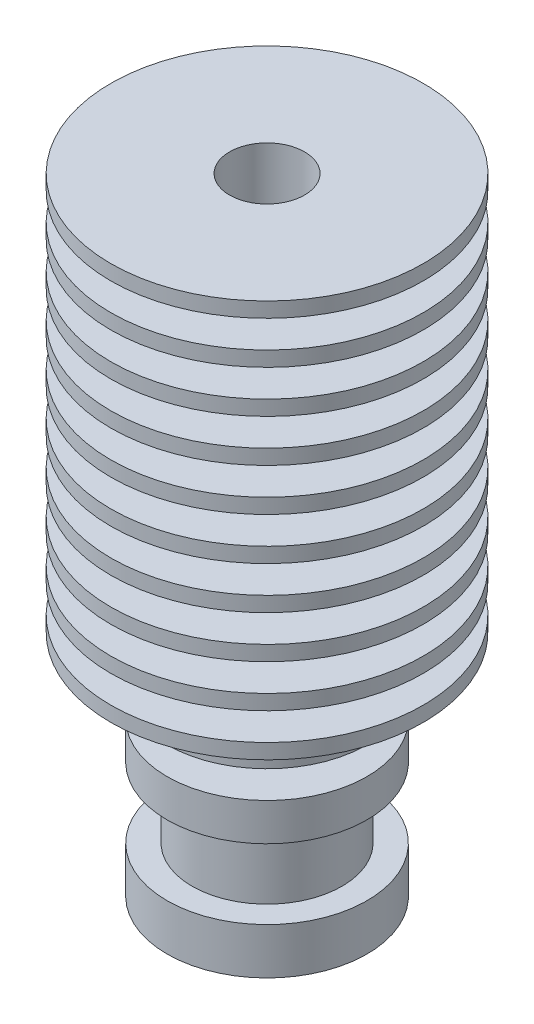
ISO-10303-21;
HEADER;
FILE_DESCRIPTION(('STEP AP214'),'2;1');
FILE_NAME('part.step','',(''),(''),'','','');
FILE_SCHEMA(('AUTOMOTIVE_DESIGN { 1 0 10303 214 1 1 1 1 }'));
ENDSEC;
DATA;
#1=APPLICATION_CONTEXT('core data for automotive mechanical design processes');
#2=APPLICATION_PROTOCOL_DEFINITION('international standard','automotive_design',2000,#1);
#3=PRODUCT_CONTEXT('',#1,'mechanical');
#4=PRODUCT('Part','Part','',(#3));
#5=PRODUCT_RELATED_PRODUCT_CATEGORY('part','',(#4));
#6=PRODUCT_DEFINITION_FORMATION('','',#4);
#7=PRODUCT_DEFINITION_CONTEXT('part definition',#1,'design');
#8=PRODUCT_DEFINITION('design','',#6,#7);
#9=PRODUCT_DEFINITION_SHAPE('','',#8);
#10=(LENGTH_UNIT() NAMED_UNIT(*) SI_UNIT(.MILLI.,.METRE.));
#11=(NAMED_UNIT(*) PLANE_ANGLE_UNIT() SI_UNIT($,.RADIAN.));
#12=(NAMED_UNIT(*) SI_UNIT($,.STERADIAN.) SOLID_ANGLE_UNIT());
#13=UNCERTAINTY_MEASURE_WITH_UNIT(LENGTH_MEASURE(1.E-05),#10,'distance_accuracy_value','');
#14=(GEOMETRIC_REPRESENTATION_CONTEXT(3) GLOBAL_UNCERTAINTY_ASSIGNED_CONTEXT((#13)) GLOBAL_UNIT_ASSIGNED_CONTEXT((#10,
#11,#12)) REPRESENTATION_CONTEXT('',''));
#15=CARTESIAN_POINT('',(0.,0.,0.));
#16=DIRECTION('',(0.,0.,1.));
#17=DIRECTION('',(1.,0.,0.));
#18=AXIS2_PLACEMENT_3D('',#15,#16,#17);
#19=CARTESIAN_POINT('',(0.,50.0999999999996,0.));
#20=DIRECTION('',(0.,-1.,0.));
#21=DIRECTION('',(0.,0.,-1.));
#22=AXIS2_PLACEMENT_3D('',#19,#20,#21);
#23=PLANE('',#22);
#24=CARTESIAN_POINT('',(0.,50.0999999999997,0.));
#25=DIRECTION('',(0.,1.,0.));
#26=DIRECTION('',(0.,0.,1.));
#27=AXIS2_PLACEMENT_3D('',#24,#25,#26);
#28=CIRCLE('',#27,12.5);
#29=CARTESIAN_POINT('',(0.,50.0999999999997,12.5));
#30=VERTEX_POINT('',#29);
#31=EDGE_CURVE('E190',#30,#30,#28,.T.);
#32=ORIENTED_EDGE('',*,*,#31,.T.);
#33=EDGE_LOOP('',(#32));
#34=FACE_BOUND('',#33,.T.);
#35=CARTESIAN_POINT('',(0.,50.0999999999996,0.));
#36=DIRECTION('',(0.,1.,0.));
#37=DIRECTION('',(0.,0.,1.));
#38=AXIS2_PLACEMENT_3D('',#35,#36,#37);
#39=CIRCLE('',#38,3.);
#40=CARTESIAN_POINT('',(0.,50.0999999999996,3.));
#41=VERTEX_POINT('',#40);
#42=EDGE_CURVE('E217',#41,#41,#39,.T.);
#43=ORIENTED_EDGE('',*,*,#42,.F.);
#44=EDGE_LOOP('',(#43));
#45=FACE_BOUND('',#44,.T.);
#46=ADVANCED_FACE('F36',(#34,#45),#23,.F.);
#47=CARTESIAN_POINT('',(0.,0.,0.));
#48=DIRECTION('',(0.,1.,0.));
#49=DIRECTION('',(0.,0.,1.));
#50=AXIS2_PLACEMENT_3D('',#47,#48,#49);
#51=PLANE('',#50);
#52=CARTESIAN_POINT('',(0.,0.,0.));
#53=DIRECTION('',(0.,1.,0.));
#54=DIRECTION('',(0.,0.,1.));
#55=AXIS2_PLACEMENT_3D('',#52,#53,#54);
#56=CIRCLE('',#55,8.);
#57=CARTESIAN_POINT('',(0.,0.,8.));
#58=VERTEX_POINT('',#57);
#59=EDGE_CURVE('E10',#58,#58,#56,.T.);
#60=ORIENTED_EDGE('',*,*,#59,.F.);
#61=EDGE_LOOP('',(#60));
#62=FACE_BOUND('',#61,.T.);
#63=CARTESIAN_POINT('',(0.,0.,0.));
#64=DIRECTION('',(0.,1.,0.));
#65=DIRECTION('',(0.,0.,1.));
#66=AXIS2_PLACEMENT_3D('',#63,#64,#65);
#67=CIRCLE('',#66,3.2);
#68=CARTESIAN_POINT('',(0.,0.,3.2));
#69=VERTEX_POINT('',#68);
#70=EDGE_CURVE('E193',#69,#69,#67,.T.);
#71=ORIENTED_EDGE('',*,*,#70,.T.);
#72=EDGE_LOOP('',(#71));
#73=FACE_BOUND('',#72,.T.);
#74=ADVANCED_FACE('F225',(#62,#73),#51,.F.);
#75=CARTESIAN_POINT('',(0.,50.0999999999996,0.));
#76=DIRECTION('',(0.,1.,0.));
#77=DIRECTION('',(0.,0.,1.));
#78=AXIS2_PLACEMENT_3D('',#75,#76,#77);
#79=CYLINDRICAL_SURFACE('',#78,8.);
#80=CARTESIAN_POINT('',(0.,3.7,0.));
#81=DIRECTION('',(0.,1.,0.));
#82=DIRECTION('',(0.,0.,1.));
#83=AXIS2_PLACEMENT_3D('',#80,#81,#82);
#84=CIRCLE('',#83,8.);
#85=CARTESIAN_POINT('',(0.,3.7,8.));
#86=VERTEX_POINT('',#85);
#87=EDGE_CURVE('E42',#86,#86,#84,.T.);
#88=ORIENTED_EDGE('',*,*,#87,.F.);
#89=EDGE_LOOP('',(#88));
#90=FACE_BOUND('',#89,.T.);
#91=ORIENTED_EDGE('',*,*,#59,.T.);
#92=EDGE_LOOP('',(#91));
#93=FACE_BOUND('',#92,.T.);
#94=ADVANCED_FACE('F230',(#90,#93),#79,.T.);
#95=CARTESIAN_POINT('',(0.,3.7,0.));
#96=DIRECTION('',(0.,-1.,0.));
#97=DIRECTION('',(0.,0.,-1.));
#98=AXIS2_PLACEMENT_3D('',#95,#96,#97);
#99=PLANE('',#98);
#100=CARTESIAN_POINT('',(0.,3.7,0.));
#101=DIRECTION('',(0.,1.,0.));
#102=DIRECTION('',(0.,0.,1.));
#103=AXIS2_PLACEMENT_3D('',#100,#101,#102);
#104=CIRCLE('',#103,6.);
#105=CARTESIAN_POINT('',(0.,3.7,6.));
#106=VERTEX_POINT('',#105);
#107=EDGE_CURVE('E46',#106,#106,#104,.T.);
#108=ORIENTED_EDGE('',*,*,#107,.F.);
#109=EDGE_LOOP('',(#108));
#110=FACE_BOUND('',#109,.T.);
#111=ORIENTED_EDGE('',*,*,#87,.T.);
#112=EDGE_LOOP('',(#111));
#113=FACE_BOUND('',#112,.T.);
#114=ADVANCED_FACE('F514',(#110,#113),#99,.F.);
#115=CARTESIAN_POINT('',(0.,50.0999999999996,0.));
#116=DIRECTION('',(0.,1.,0.));
#117=DIRECTION('',(0.,0.,1.));
#118=AXIS2_PLACEMENT_3D('',#115,#116,#117);
#119=CYLINDRICAL_SURFACE('',#118,6.);
#120=CARTESIAN_POINT('',(0.,9.3,0.));
#121=DIRECTION('',(0.,1.,0.));
#122=DIRECTION('',(0.,0.,1.));
#123=AXIS2_PLACEMENT_3D('',#120,#121,#122);
#124=CIRCLE('',#123,6.);
#125=CARTESIAN_POINT('',(0.,9.3,6.));
#126=VERTEX_POINT('',#125);
#127=EDGE_CURVE('E50',#126,#126,#124,.T.);
#128=ORIENTED_EDGE('',*,*,#127,.F.);
#129=EDGE_LOOP('',(#128));
#130=FACE_BOUND('',#129,.T.);
#131=ORIENTED_EDGE('',*,*,#107,.T.);
#132=EDGE_LOOP('',(#131));
#133=FACE_BOUND('',#132,.T.);
#134=ADVANCED_FACE('F508',(#130,#133),#119,.T.);
#135=CARTESIAN_POINT('',(0.,9.3,0.));
#136=DIRECTION('',(0.,1.,0.));
#137=DIRECTION('',(0.,0.,1.));
#138=AXIS2_PLACEMENT_3D('',#135,#136,#137);
#139=PLANE('',#138);
#140=CARTESIAN_POINT('',(0.,9.3,0.));
#141=DIRECTION('',(0.,1.,0.));
#142=DIRECTION('',(0.,0.,1.));
#143=AXIS2_PLACEMENT_3D('',#140,#141,#142);
#144=CIRCLE('',#143,8.);
#145=CARTESIAN_POINT('',(0.,9.3,8.));
#146=VERTEX_POINT('',#145);
#147=EDGE_CURVE('E55',#146,#146,#144,.T.);
#148=ORIENTED_EDGE('',*,*,#147,.F.);
#149=EDGE_LOOP('',(#148));
#150=FACE_BOUND('',#149,.T.);
#151=ORIENTED_EDGE('',*,*,#127,.T.);
#152=EDGE_LOOP('',(#151));
#153=FACE_BOUND('',#152,.T.);
#154=ADVANCED_FACE('F502',(#150,#153),#139,.F.);
#155=CARTESIAN_POINT('',(0.,50.0999999999996,0.));
#156=DIRECTION('',(0.,1.,0.));
#157=DIRECTION('',(0.,0.,1.));
#158=AXIS2_PLACEMENT_3D('',#155,#156,#157);
#159=CYLINDRICAL_SURFACE('',#158,8.);
#160=CARTESIAN_POINT('',(0.,12.3,0.));
#161=DIRECTION('',(0.,1.,0.));
#162=DIRECTION('',(0.,0.,1.));
#163=AXIS2_PLACEMENT_3D('',#160,#161,#162);
#164=CIRCLE('',#163,8.);
#165=CARTESIAN_POINT('',(0.,12.3,8.));
#166=VERTEX_POINT('',#165);
#167=EDGE_CURVE('E58',#166,#166,#164,.T.);
#168=ORIENTED_EDGE('',*,*,#167,.F.);
#169=EDGE_LOOP('',(#168));
#170=FACE_BOUND('',#169,.T.);
#171=ORIENTED_EDGE('',*,*,#147,.T.);
#172=EDGE_LOOP('',(#171));
#173=FACE_BOUND('',#172,.T.);
#174=ADVANCED_FACE('F496',(#170,#173),#159,.T.);
#175=CARTESIAN_POINT('',(0.,12.3,0.));
#176=DIRECTION('',(0.,-1.,0.));
#177=DIRECTION('',(0.,0.,-1.));
#178=AXIS2_PLACEMENT_3D('',#175,#176,#177);
#179=PLANE('',#178);
#180=CARTESIAN_POINT('',(0.,12.3,0.));
#181=DIRECTION('',(0.,1.,0.));
#182=DIRECTION('',(0.,0.,1.));
#183=AXIS2_PLACEMENT_3D('',#180,#181,#182);
#184=CIRCLE('',#183,4.5);
#185=CARTESIAN_POINT('',(0.,12.3,4.5));
#186=VERTEX_POINT('',#185);
#187=EDGE_CURVE('E61',#186,#186,#184,.T.);
#188=ORIENTED_EDGE('',*,*,#187,.F.);
#189=EDGE_LOOP('',(#188));
#190=FACE_BOUND('',#189,.T.);
#191=ORIENTED_EDGE('',*,*,#167,.T.);
#192=EDGE_LOOP('',(#191));
#193=FACE_BOUND('',#192,.T.);
#194=ADVANCED_FACE('F490',(#190,#193),#179,.F.);
#195=CARTESIAN_POINT('',(0.,50.0999999999996,0.));
#196=DIRECTION('',(0.,1.,0.));
#197=DIRECTION('',(0.,0.,1.));
#198=AXIS2_PLACEMENT_3D('',#195,#196,#197);
#199=CYLINDRICAL_SURFACE('',#198,4.5);
#200=CARTESIAN_POINT('',(0.,14.5,0.));
#201=DIRECTION('',(0.,1.,0.));
#202=DIRECTION('',(0.,0.,1.));
#203=AXIS2_PLACEMENT_3D('',#200,#201,#202);
#204=CIRCLE('',#203,4.5);
#205=CARTESIAN_POINT('',(0.,14.5,4.5));
#206=VERTEX_POINT('',#205);
#207=EDGE_CURVE('E64',#206,#206,#204,.T.);
#208=ORIENTED_EDGE('',*,*,#207,.F.);
#209=EDGE_LOOP('',(#208));
#210=FACE_BOUND('',#209,.T.);
#211=ORIENTED_EDGE('',*,*,#187,.T.);
#212=EDGE_LOOP('',(#211));
#213=FACE_BOUND('',#212,.T.);
#214=ADVANCED_FACE('F484',(#210,#213),#199,.T.);
#215=CARTESIAN_POINT('',(0.,14.5,0.));
#216=DIRECTION('',(0.,1.,0.));
#217=DIRECTION('',(0.,0.,1.));
#218=AXIS2_PLACEMENT_3D('',#215,#216,#217);
#219=PLANE('',#218);
#220=CARTESIAN_POINT('',(0.,14.5,0.));
#221=DIRECTION('',(0.,1.,0.));
#222=DIRECTION('',(0.,0.,1.));
#223=AXIS2_PLACEMENT_3D('',#220,#221,#222);
#224=CIRCLE('',#223,8.);
#225=CARTESIAN_POINT('',(0.,14.5,8.));
#226=VERTEX_POINT('',#225);
#227=EDGE_CURVE('E67',#226,#226,#224,.T.);
#228=ORIENTED_EDGE('',*,*,#227,.F.);
#229=EDGE_LOOP('',(#228));
#230=FACE_BOUND('',#229,.T.);
#231=ORIENTED_EDGE('',*,*,#207,.T.);
#232=EDGE_LOOP('',(#231));
#233=FACE_BOUND('',#232,.T.);
#234=ADVANCED_FACE('F478',(#230,#233),#219,.F.);
#235=CARTESIAN_POINT('',(0.,50.0999999999996,0.));
#236=DIRECTION('',(0.,1.,0.));
#237=DIRECTION('',(0.,0.,1.));
#238=AXIS2_PLACEMENT_3D('',#235,#236,#237);
#239=CYLINDRICAL_SURFACE('',#238,8.);
#240=CARTESIAN_POINT('',(0.,16.1,0.));
#241=DIRECTION('',(0.,1.,0.));
#242=DIRECTION('',(0.,0.,1.));
#243=AXIS2_PLACEMENT_3D('',#240,#241,#242);
#244=CIRCLE('',#243,8.);
#245=CARTESIAN_POINT('',(0.,16.1,8.));
#246=VERTEX_POINT('',#245);
#247=EDGE_CURVE('E70',#246,#246,#244,.T.);
#248=ORIENTED_EDGE('',*,*,#247,.F.);
#249=EDGE_LOOP('',(#248));
#250=FACE_BOUND('',#249,.T.);
#251=ORIENTED_EDGE('',*,*,#227,.T.);
#252=EDGE_LOOP('',(#251));
#253=FACE_BOUND('',#252,.T.);
#254=ADVANCED_FACE('F472',(#250,#253),#239,.T.);
#255=CARTESIAN_POINT('',(0.,16.1,0.));
#256=DIRECTION('',(0.,-1.,0.));
#257=DIRECTION('',(0.,0.,-1.));
#258=AXIS2_PLACEMENT_3D('',#255,#256,#257);
#259=PLANE('',#258);
#260=CARTESIAN_POINT('',(0.,16.1,0.));
#261=DIRECTION('',(0.,1.,0.));
#262=DIRECTION('',(0.,0.,1.));
#263=AXIS2_PLACEMENT_3D('',#260,#261,#262);
#264=CIRCLE('',#263,4.49999999999996);
#265=CARTESIAN_POINT('',(0.,16.1,4.49999999999996));
#266=VERTEX_POINT('',#265);
#267=EDGE_CURVE('E73',#266,#266,#264,.T.);
#268=ORIENTED_EDGE('',*,*,#267,.F.);
#269=EDGE_LOOP('',(#268));
#270=FACE_BOUND('',#269,.T.);
#271=ORIENTED_EDGE('',*,*,#247,.T.);
#272=EDGE_LOOP('',(#271));
#273=FACE_BOUND('',#272,.T.);
#274=ADVANCED_FACE('F466',(#270,#273),#259,.F.);
#275=CARTESIAN_POINT('',(0.,50.0999999999996,0.));
#276=DIRECTION('',(0.,1.,0.));
#277=DIRECTION('',(0.,0.,1.));
#278=AXIS2_PLACEMENT_3D('',#275,#276,#277);
#279=CYLINDRICAL_SURFACE('',#278,4.49999999999996);
#280=CARTESIAN_POINT('',(0.,18.3,0.));
#281=DIRECTION('',(0.,1.,0.));
#282=DIRECTION('',(0.,0.,1.));
#283=AXIS2_PLACEMENT_3D('',#280,#281,#282);
#284=CIRCLE('',#283,4.49999999999996);
#285=CARTESIAN_POINT('',(0.,18.3,4.49999999999996));
#286=VERTEX_POINT('',#285);
#287=EDGE_CURVE('E76',#286,#286,#284,.T.);
#288=ORIENTED_EDGE('',*,*,#287,.F.);
#289=EDGE_LOOP('',(#288));
#290=FACE_BOUND('',#289,.T.);
#291=ORIENTED_EDGE('',*,*,#267,.T.);
#292=EDGE_LOOP('',(#291));
#293=FACE_BOUND('',#292,.T.);
#294=ADVANCED_FACE('F460',(#290,#293),#279,.T.);
#295=CARTESIAN_POINT('',(-1.11109038636314E-13,18.3,0.));
#296=DIRECTION('',(0.,1.,0.));
#297=DIRECTION('',(0.,0.,1.));
#298=AXIS2_PLACEMENT_3D('',#295,#296,#297);
#299=PLANE('',#298);
#300=CARTESIAN_POINT('',(0.,18.3000000000001,0.));
#301=DIRECTION('',(0.,1.,0.));
#302=DIRECTION('',(0.,0.,1.));
#303=AXIS2_PLACEMENT_3D('',#300,#301,#302);
#304=CIRCLE('',#303,12.5);
#305=CARTESIAN_POINT('',(0.,18.3000000000001,12.5));
#306=VERTEX_POINT('',#305);
#307=EDGE_CURVE('E79',#306,#306,#304,.T.);
#308=ORIENTED_EDGE('',*,*,#307,.F.);
#309=EDGE_LOOP('',(#308));
#310=FACE_BOUND('',#309,.T.);
#311=ORIENTED_EDGE('',*,*,#287,.T.);
#312=EDGE_LOOP('',(#311));
#313=FACE_BOUND('',#312,.T.);
#314=ADVANCED_FACE('F454',(#310,#313),#299,.F.);
#315=CARTESIAN_POINT('',(0.,50.0999999999996,0.));
#316=DIRECTION('',(0.,1.,0.));
#317=DIRECTION('',(0.,0.,1.));
#318=AXIS2_PLACEMENT_3D('',#315,#316,#317);
#319=CYLINDRICAL_SURFACE('',#318,12.5);
#320=CARTESIAN_POINT('',(0.,19.5,0.));
#321=DIRECTION('',(0.,1.,0.));
#322=DIRECTION('',(0.,0.,1.));
#323=AXIS2_PLACEMENT_3D('',#320,#321,#322);
#324=CIRCLE('',#323,12.5);
#325=CARTESIAN_POINT('',(0.,19.5,12.5));
#326=VERTEX_POINT('',#325);
#327=EDGE_CURVE('E82',#326,#326,#324,.T.);
#328=ORIENTED_EDGE('',*,*,#327,.F.);
#329=EDGE_LOOP('',(#328));
#330=FACE_BOUND('',#329,.T.);
#331=ORIENTED_EDGE('',*,*,#307,.T.);
#332=EDGE_LOOP('',(#331));
#333=FACE_BOUND('',#332,.T.);
#334=ADVANCED_FACE('F448',(#330,#333),#319,.T.);
#335=CARTESIAN_POINT('',(0.,19.5,0.));
#336=DIRECTION('',(0.,-1.,0.));
#337=DIRECTION('',(0.,0.,-1.));
#338=AXIS2_PLACEMENT_3D('',#335,#336,#337);
#339=PLANE('',#338);
#340=CARTESIAN_POINT('',(0.,19.5,0.));
#341=DIRECTION('',(0.,1.,0.));
#342=DIRECTION('',(0.,0.,1.));
#343=AXIS2_PLACEMENT_3D('',#340,#341,#342);
#344=CIRCLE('',#343,4.49999999999995);
#345=CARTESIAN_POINT('',(0.,19.5,4.49999999999995));
#346=VERTEX_POINT('',#345);
#347=EDGE_CURVE('E85',#346,#346,#344,.T.);
#348=ORIENTED_EDGE('',*,*,#347,.F.);
#349=EDGE_LOOP('',(#348));
#350=FACE_BOUND('',#349,.T.);
#351=ORIENTED_EDGE('',*,*,#327,.T.);
#352=EDGE_LOOP('',(#351));
#353=FACE_BOUND('',#352,.T.);
#354=ADVANCED_FACE('F442',(#350,#353),#339,.F.);
#355=CARTESIAN_POINT('',(0.,50.0999999999996,0.));
#356=DIRECTION('',(0.,1.,0.));
#357=DIRECTION('',(0.,0.,1.));
#358=AXIS2_PLACEMENT_3D('',#355,#356,#357);
#359=CYLINDRICAL_SURFACE('',#358,4.49999999999995);
#360=CARTESIAN_POINT('',(0.,21.7,0.));
#361=DIRECTION('',(0.,1.,0.));
#362=DIRECTION('',(0.,0.,1.));
#363=AXIS2_PLACEMENT_3D('',#360,#361,#362);
#364=CIRCLE('',#363,4.49999999999995);
#365=CARTESIAN_POINT('',(0.,21.7,4.49999999999995));
#366=VERTEX_POINT('',#365);
#367=EDGE_CURVE('E88',#366,#366,#364,.T.);
#368=ORIENTED_EDGE('',*,*,#367,.F.);
#369=EDGE_LOOP('',(#368));
#370=FACE_BOUND('',#369,.T.);
#371=ORIENTED_EDGE('',*,*,#347,.T.);
#372=EDGE_LOOP('',(#371));
#373=FACE_BOUND('',#372,.T.);
#374=ADVANCED_FACE('F436',(#370,#373),#359,.T.);
#375=CARTESIAN_POINT('',(0.,21.7,0.));
#376=DIRECTION('',(0.,1.,0.));
#377=DIRECTION('',(0.,0.,1.));
#378=AXIS2_PLACEMENT_3D('',#375,#376,#377);
#379=PLANE('',#378);
#380=CARTESIAN_POINT('',(0.,21.7,0.));
#381=DIRECTION('',(0.,1.,0.));
#382=DIRECTION('',(0.,0.,1.));
#383=AXIS2_PLACEMENT_3D('',#380,#381,#382);
#384=CIRCLE('',#383,12.5);
#385=CARTESIAN_POINT('',(0.,21.7,12.5));
#386=VERTEX_POINT('',#385);
#387=EDGE_CURVE('E91',#386,#386,#384,.T.);
#388=ORIENTED_EDGE('',*,*,#387,.F.);
#389=EDGE_LOOP('',(#388));
#390=FACE_BOUND('',#389,.T.);
#391=ORIENTED_EDGE('',*,*,#367,.T.);
#392=EDGE_LOOP('',(#391));
#393=FACE_BOUND('',#392,.T.);
#394=ADVANCED_FACE('F430',(#390,#393),#379,.F.);
#395=CARTESIAN_POINT('',(0.,50.0999999999996,0.));
#396=DIRECTION('',(0.,1.,0.));
#397=DIRECTION('',(0.,0.,1.));
#398=AXIS2_PLACEMENT_3D('',#395,#396,#397);
#399=CYLINDRICAL_SURFACE('',#398,12.5);
#400=CARTESIAN_POINT('',(0.,22.9,0.));
#401=DIRECTION('',(0.,1.,0.));
#402=DIRECTION('',(0.,0.,1.));
#403=AXIS2_PLACEMENT_3D('',#400,#401,#402);
#404=CIRCLE('',#403,12.5);
#405=CARTESIAN_POINT('',(0.,22.9,12.5));
#406=VERTEX_POINT('',#405);
#407=EDGE_CURVE('E94',#406,#406,#404,.T.);
#408=ORIENTED_EDGE('',*,*,#407,.F.);
#409=EDGE_LOOP('',(#408));
#410=FACE_BOUND('',#409,.T.);
#411=ORIENTED_EDGE('',*,*,#387,.T.);
#412=EDGE_LOOP('',(#411));
#413=FACE_BOUND('',#412,.T.);
#414=ADVANCED_FACE('F424',(#410,#413),#399,.T.);
#415=CARTESIAN_POINT('',(0.,22.9,0.));
#416=DIRECTION('',(0.,-1.,0.));
#417=DIRECTION('',(0.,0.,-1.));
#418=AXIS2_PLACEMENT_3D('',#415,#416,#417);
#419=PLANE('',#418);
#420=CARTESIAN_POINT('',(0.,22.9,0.));
#421=DIRECTION('',(0.,1.,0.));
#422=DIRECTION('',(0.,0.,1.));
#423=AXIS2_PLACEMENT_3D('',#420,#421,#422);
#424=CIRCLE('',#423,4.49999999999995);
#425=CARTESIAN_POINT('',(0.,22.9,4.49999999999995));
#426=VERTEX_POINT('',#425);
#427=EDGE_CURVE('E97',#426,#426,#424,.T.);
#428=ORIENTED_EDGE('',*,*,#427,.F.);
#429=EDGE_LOOP('',(#428));
#430=FACE_BOUND('',#429,.T.);
#431=ORIENTED_EDGE('',*,*,#407,.T.);
#432=EDGE_LOOP('',(#431));
#433=FACE_BOUND('',#432,.T.);
#434=ADVANCED_FACE('F418',(#430,#433),#419,.F.);
#435=CARTESIAN_POINT('',(0.,50.0999999999996,0.));
#436=DIRECTION('',(0.,1.,0.));
#437=DIRECTION('',(0.,0.,1.));
#438=AXIS2_PLACEMENT_3D('',#435,#436,#437);
#439=CYLINDRICAL_SURFACE('',#438,4.49999999999995);
#440=CARTESIAN_POINT('',(0.,25.0999999999999,0.));
#441=DIRECTION('',(0.,1.,0.));
#442=DIRECTION('',(0.,0.,1.));
#443=AXIS2_PLACEMENT_3D('',#440,#441,#442);
#444=CIRCLE('',#443,4.49999999999995);
#445=CARTESIAN_POINT('',(0.,25.0999999999999,4.49999999999995));
#446=VERTEX_POINT('',#445);
#447=EDGE_CURVE('E100',#446,#446,#444,.T.);
#448=ORIENTED_EDGE('',*,*,#447,.F.);
#449=EDGE_LOOP('',(#448));
#450=FACE_BOUND('',#449,.T.);
#451=ORIENTED_EDGE('',*,*,#427,.T.);
#452=EDGE_LOOP('',(#451));
#453=FACE_BOUND('',#452,.T.);
#454=ADVANCED_FACE('F412',(#450,#453),#439,.T.);
#455=CARTESIAN_POINT('',(0.,25.0999999999999,0.));
#456=DIRECTION('',(0.,1.,0.));
#457=DIRECTION('',(0.,0.,1.));
#458=AXIS2_PLACEMENT_3D('',#455,#456,#457);
#459=PLANE('',#458);
#460=CARTESIAN_POINT('',(0.,25.0999999999999,0.));
#461=DIRECTION('',(0.,1.,0.));
#462=DIRECTION('',(0.,0.,1.));
#463=AXIS2_PLACEMENT_3D('',#460,#461,#462);
#464=CIRCLE('',#463,12.5);
#465=CARTESIAN_POINT('',(0.,25.0999999999999,12.5));
#466=VERTEX_POINT('',#465);
#467=EDGE_CURVE('E103',#466,#466,#464,.T.);
#468=ORIENTED_EDGE('',*,*,#467,.F.);
#469=EDGE_LOOP('',(#468));
#470=FACE_BOUND('',#469,.T.);
#471=ORIENTED_EDGE('',*,*,#447,.T.);
#472=EDGE_LOOP('',(#471));
#473=FACE_BOUND('',#472,.T.);
#474=ADVANCED_FACE('F406',(#470,#473),#459,.F.);
#475=CARTESIAN_POINT('',(0.,50.0999999999996,0.));
#476=DIRECTION('',(0.,1.,0.));
#477=DIRECTION('',(0.,0.,1.));
#478=AXIS2_PLACEMENT_3D('',#475,#476,#477);
#479=CYLINDRICAL_SURFACE('',#478,12.5);
#480=CARTESIAN_POINT('',(0.,26.2999999999999,0.));
#481=DIRECTION('',(0.,1.,0.));
#482=DIRECTION('',(0.,0.,1.));
#483=AXIS2_PLACEMENT_3D('',#480,#481,#482);
#484=CIRCLE('',#483,12.5);
#485=CARTESIAN_POINT('',(0.,26.2999999999999,12.5));
#486=VERTEX_POINT('',#485);
#487=EDGE_CURVE('E106',#486,#486,#484,.T.);
#488=ORIENTED_EDGE('',*,*,#487,.F.);
#489=EDGE_LOOP('',(#488));
#490=FACE_BOUND('',#489,.T.);
#491=ORIENTED_EDGE('',*,*,#467,.T.);
#492=EDGE_LOOP('',(#491));
#493=FACE_BOUND('',#492,.T.);
#494=ADVANCED_FACE('F400',(#490,#493),#479,.T.);
#495=CARTESIAN_POINT('',(-1.02652261690927E-13,26.2999999999999,0.));
#496=DIRECTION('',(0.,-1.,0.));
#497=DIRECTION('',(0.,0.,-1.));
#498=AXIS2_PLACEMENT_3D('',#495,#496,#497);
#499=PLANE('',#498);
#500=CARTESIAN_POINT('',(0.,26.2999999999999,0.));
#501=DIRECTION('',(0.,1.,0.));
#502=DIRECTION('',(0.,0.,1.));
#503=AXIS2_PLACEMENT_3D('',#500,#501,#502);
#504=CIRCLE('',#503,4.49999999999995);
#505=CARTESIAN_POINT('',(0.,26.2999999999999,4.49999999999995));
#506=VERTEX_POINT('',#505);
#507=EDGE_CURVE('E109',#506,#506,#504,.T.);
#508=ORIENTED_EDGE('',*,*,#507,.F.);
#509=EDGE_LOOP('',(#508));
#510=FACE_BOUND('',#509,.T.);
#511=ORIENTED_EDGE('',*,*,#487,.T.);
#512=EDGE_LOOP('',(#511));
#513=FACE_BOUND('',#512,.T.);
#514=ADVANCED_FACE('F394',(#510,#513),#499,.F.);
#515=CARTESIAN_POINT('',(0.,50.0999999999996,0.));
#516=DIRECTION('',(0.,1.,0.));
#517=DIRECTION('',(0.,0.,1.));
#518=AXIS2_PLACEMENT_3D('',#515,#516,#517);
#519=CYLINDRICAL_SURFACE('',#518,4.49999999999995);
#520=CARTESIAN_POINT('',(0.,28.4999999999999,0.));
#521=DIRECTION('',(0.,1.,0.));
#522=DIRECTION('',(0.,0.,1.));
#523=AXIS2_PLACEMENT_3D('',#520,#521,#522);
#524=CIRCLE('',#523,4.49999999999995);
#525=CARTESIAN_POINT('',(0.,28.4999999999999,4.49999999999995));
#526=VERTEX_POINT('',#525);
#527=EDGE_CURVE('E112',#526,#526,#524,.T.);
#528=ORIENTED_EDGE('',*,*,#527,.F.);
#529=EDGE_LOOP('',(#528));
#530=FACE_BOUND('',#529,.T.);
#531=ORIENTED_EDGE('',*,*,#507,.T.);
#532=EDGE_LOOP('',(#531));
#533=FACE_BOUND('',#532,.T.);
#534=ADVANCED_FACE('F388',(#530,#533),#519,.T.);
#535=CARTESIAN_POINT('',(0.,28.4999999999999,0.));
#536=DIRECTION('',(0.,1.,0.));
#537=DIRECTION('',(0.,0.,1.));
#538=AXIS2_PLACEMENT_3D('',#535,#536,#537);
#539=PLANE('',#538);
#540=CARTESIAN_POINT('',(0.,28.4999999999999,0.));
#541=DIRECTION('',(0.,1.,0.));
#542=DIRECTION('',(0.,0.,1.));
#543=AXIS2_PLACEMENT_3D('',#540,#541,#542);
#544=CIRCLE('',#543,12.5);
#545=CARTESIAN_POINT('',(0.,28.4999999999999,12.5));
#546=VERTEX_POINT('',#545);
#547=EDGE_CURVE('E115',#546,#546,#544,.T.);
#548=ORIENTED_EDGE('',*,*,#547,.F.);
#549=EDGE_LOOP('',(#548));
#550=FACE_BOUND('',#549,.T.);
#551=ORIENTED_EDGE('',*,*,#527,.T.);
#552=EDGE_LOOP('',(#551));
#553=FACE_BOUND('',#552,.T.);
#554=ADVANCED_FACE('F382',(#550,#553),#539,.F.);
#555=CARTESIAN_POINT('',(0.,50.0999999999996,0.));
#556=DIRECTION('',(0.,1.,0.));
#557=DIRECTION('',(0.,0.,1.));
#558=AXIS2_PLACEMENT_3D('',#555,#556,#557);
#559=CYLINDRICAL_SURFACE('',#558,12.5);
#560=CARTESIAN_POINT('',(0.,29.6999999999999,0.));
#561=DIRECTION('',(0.,1.,0.));
#562=DIRECTION('',(0.,0.,1.));
#563=AXIS2_PLACEMENT_3D('',#560,#561,#562);
#564=CIRCLE('',#563,12.5);
#565=CARTESIAN_POINT('',(0.,29.6999999999999,12.5));
#566=VERTEX_POINT('',#565);
#567=EDGE_CURVE('E118',#566,#566,#564,.T.);
#568=ORIENTED_EDGE('',*,*,#567,.F.);
#569=EDGE_LOOP('',(#568));
#570=FACE_BOUND('',#569,.T.);
#571=ORIENTED_EDGE('',*,*,#547,.T.);
#572=EDGE_LOOP('',(#571));
#573=FACE_BOUND('',#572,.T.);
#574=ADVANCED_FACE('F376',(#570,#573),#559,.T.);
#575=CARTESIAN_POINT('',(-1.54563861709533E-13,29.6999999999999,0.));
#576=DIRECTION('',(0.,-1.,0.));
#577=DIRECTION('',(0.,0.,-1.));
#578=AXIS2_PLACEMENT_3D('',#575,#576,#577);
#579=PLANE('',#578);
#580=CARTESIAN_POINT('',(0.,29.6999999999998,0.));
#581=DIRECTION('',(0.,1.,0.));
#582=DIRECTION('',(0.,0.,1.));
#583=AXIS2_PLACEMENT_3D('',#580,#581,#582);
#584=CIRCLE('',#583,6.49999999999995);
#585=CARTESIAN_POINT('',(0.,29.6999999999998,6.49999999999995));
#586=VERTEX_POINT('',#585);
#587=EDGE_CURVE('E121',#586,#586,#584,.T.);
#588=ORIENTED_EDGE('',*,*,#587,.F.);
#589=EDGE_LOOP('',(#588));
#590=FACE_BOUND('',#589,.T.);
#591=ORIENTED_EDGE('',*,*,#567,.T.);
#592=EDGE_LOOP('',(#591));
#593=FACE_BOUND('',#592,.T.);
#594=ADVANCED_FACE('F370',(#590,#593),#579,.F.);
#595=CARTESIAN_POINT('',(0.,50.0999999999996,0.));
#596=DIRECTION('',(0.,1.,0.));
#597=DIRECTION('',(0.,0.,1.));
#598=AXIS2_PLACEMENT_3D('',#595,#596,#597);
#599=CYLINDRICAL_SURFACE('',#598,6.49999999999995);
#600=CARTESIAN_POINT('',(0.,31.8999999999998,0.));
#601=DIRECTION('',(0.,1.,0.));
#602=DIRECTION('',(0.,0.,1.));
#603=AXIS2_PLACEMENT_3D('',#600,#601,#602);
#604=CIRCLE('',#603,6.49999999999995);
#605=CARTESIAN_POINT('',(0.,31.8999999999998,6.49999999999995));
#606=VERTEX_POINT('',#605);
#607=EDGE_CURVE('E124',#606,#606,#604,.T.);
#608=ORIENTED_EDGE('',*,*,#607,.F.);
#609=EDGE_LOOP('',(#608));
#610=FACE_BOUND('',#609,.T.);
#611=ORIENTED_EDGE('',*,*,#587,.T.);
#612=EDGE_LOOP('',(#611));
#613=FACE_BOUND('',#612,.T.);
#614=ADVANCED_FACE('F364',(#610,#613),#599,.T.);
#615=CARTESIAN_POINT('',(-1.4756714368976E-13,31.8999999999999,0.));
#616=DIRECTION('',(0.,1.,0.));
#617=DIRECTION('',(0.,0.,1.));
#618=AXIS2_PLACEMENT_3D('',#615,#616,#617);
#619=PLANE('',#618);
#620=CARTESIAN_POINT('',(0.,31.8999999999999,0.));
#621=DIRECTION('',(0.,1.,0.));
#622=DIRECTION('',(0.,0.,1.));
#623=AXIS2_PLACEMENT_3D('',#620,#621,#622);
#624=CIRCLE('',#623,12.5);
#625=CARTESIAN_POINT('',(0.,31.8999999999999,12.5));
#626=VERTEX_POINT('',#625);
#627=EDGE_CURVE('E127',#626,#626,#624,.T.);
#628=ORIENTED_EDGE('',*,*,#627,.F.);
#629=EDGE_LOOP('',(#628));
#630=FACE_BOUND('',#629,.T.);
#631=ORIENTED_EDGE('',*,*,#607,.T.);
#632=EDGE_LOOP('',(#631));
#633=FACE_BOUND('',#632,.T.);
#634=ADVANCED_FACE('F358',(#630,#633),#619,.F.);
#635=CARTESIAN_POINT('',(0.,50.0999999999996,0.));
#636=DIRECTION('',(0.,1.,0.));
#637=DIRECTION('',(0.,0.,1.));
#638=AXIS2_PLACEMENT_3D('',#635,#636,#637);
#639=CYLINDRICAL_SURFACE('',#638,12.5);
#640=CARTESIAN_POINT('',(0.,33.0999999999998,0.));
#641=DIRECTION('',(0.,1.,0.));
#642=DIRECTION('',(0.,0.,1.));
#643=AXIS2_PLACEMENT_3D('',#640,#641,#642);
#644=CIRCLE('',#643,12.5);
#645=CARTESIAN_POINT('',(0.,33.0999999999998,12.5));
#646=VERTEX_POINT('',#645);
#647=EDGE_CURVE('E130',#646,#646,#644,.T.);
#648=ORIENTED_EDGE('',*,*,#647,.F.);
#649=EDGE_LOOP('',(#648));
#650=FACE_BOUND('',#649,.T.);
#651=ORIENTED_EDGE('',*,*,#627,.T.);
#652=EDGE_LOOP('',(#651));
#653=FACE_BOUND('',#652,.T.);
#654=ADVANCED_FACE('F352',(#650,#653),#639,.T.);
#655=CARTESIAN_POINT('',(0.,33.0999999999998,0.));
#656=DIRECTION('',(0.,-1.,0.));
#657=DIRECTION('',(0.,0.,-1.));
#658=AXIS2_PLACEMENT_3D('',#655,#656,#657);
#659=PLANE('',#658);
#660=CARTESIAN_POINT('',(0.,33.0999999999998,0.));
#661=DIRECTION('',(0.,1.,0.));
#662=DIRECTION('',(0.,0.,1.));
#663=AXIS2_PLACEMENT_3D('',#660,#661,#662);
#664=CIRCLE('',#663,7.49999999999995);
#665=CARTESIAN_POINT('',(0.,33.0999999999998,7.49999999999995));
#666=VERTEX_POINT('',#665);
#667=EDGE_CURVE('E133',#666,#666,#664,.T.);
#668=ORIENTED_EDGE('',*,*,#667,.F.);
#669=EDGE_LOOP('',(#668));
#670=FACE_BOUND('',#669,.T.);
#671=ORIENTED_EDGE('',*,*,#647,.T.);
#672=EDGE_LOOP('',(#671));
#673=FACE_BOUND('',#672,.T.);
#674=ADVANCED_FACE('F346',(#670,#673),#659,.F.);
#675=CARTESIAN_POINT('',(0.,50.0999999999996,0.));
#676=DIRECTION('',(0.,1.,0.));
#677=DIRECTION('',(0.,0.,1.));
#678=AXIS2_PLACEMENT_3D('',#675,#676,#677);
#679=CYLINDRICAL_SURFACE('',#678,7.49999999999995);
#680=CARTESIAN_POINT('',(0.,35.2999999999998,0.));
#681=DIRECTION('',(0.,1.,0.));
#682=DIRECTION('',(0.,0.,1.));
#683=AXIS2_PLACEMENT_3D('',#680,#681,#682);
#684=CIRCLE('',#683,7.49999999999995);
#685=CARTESIAN_POINT('',(0.,35.2999999999998,7.49999999999995));
#686=VERTEX_POINT('',#685);
#687=EDGE_CURVE('E136',#686,#686,#684,.T.);
#688=ORIENTED_EDGE('',*,*,#687,.F.);
#689=EDGE_LOOP('',(#688));
#690=FACE_BOUND('',#689,.T.);
#691=ORIENTED_EDGE('',*,*,#667,.T.);
#692=EDGE_LOOP('',(#691));
#693=FACE_BOUND('',#692,.T.);
#694=ADVANCED_FACE('F340',(#690,#693),#679,.T.);
#695=CARTESIAN_POINT('',(0.,35.2999999999998,0.));
#696=DIRECTION('',(0.,1.,0.));
#697=DIRECTION('',(0.,0.,1.));
#698=AXIS2_PLACEMENT_3D('',#695,#696,#697);
#699=PLANE('',#698);
#700=CARTESIAN_POINT('',(0.,35.2999999999998,0.));
#701=DIRECTION('',(0.,1.,0.));
#702=DIRECTION('',(0.,0.,1.));
#703=AXIS2_PLACEMENT_3D('',#700,#701,#702);
#704=CIRCLE('',#703,12.5);
#705=CARTESIAN_POINT('',(0.,35.2999999999998,12.5));
#706=VERTEX_POINT('',#705);
#707=EDGE_CURVE('E139',#706,#706,#704,.T.);
#708=ORIENTED_EDGE('',*,*,#707,.F.);
#709=EDGE_LOOP('',(#708));
#710=FACE_BOUND('',#709,.T.);
#711=ORIENTED_EDGE('',*,*,#687,.T.);
#712=EDGE_LOOP('',(#711));
#713=FACE_BOUND('',#712,.T.);
#714=ADVANCED_FACE('F334',(#710,#713),#699,.F.);
#715=CARTESIAN_POINT('',(0.,50.0999999999996,0.));
#716=DIRECTION('',(0.,1.,0.));
#717=DIRECTION('',(0.,0.,1.));
#718=AXIS2_PLACEMENT_3D('',#715,#716,#717);
#719=CYLINDRICAL_SURFACE('',#718,12.5);
#720=CARTESIAN_POINT('',(0.,36.4999999999998,0.));
#721=DIRECTION('',(0.,1.,0.));
#722=DIRECTION('',(0.,0.,1.));
#723=AXIS2_PLACEMENT_3D('',#720,#721,#722);
#724=CIRCLE('',#723,12.5);
#725=CARTESIAN_POINT('',(0.,36.4999999999998,12.5));
#726=VERTEX_POINT('',#725);
#727=EDGE_CURVE('E142',#726,#726,#724,.T.);
#728=ORIENTED_EDGE('',*,*,#727,.F.);
#729=EDGE_LOOP('',(#728));
#730=FACE_BOUND('',#729,.T.);
#731=ORIENTED_EDGE('',*,*,#707,.T.);
#732=EDGE_LOOP('',(#731));
#733=FACE_BOUND('',#732,.T.);
#734=ADVANCED_FACE('F328',(#730,#733),#719,.T.);
#735=CARTESIAN_POINT('',(-2.0261570199409E-13,36.4999999999998,0.));
#736=DIRECTION('',(0.,-1.,0.));
#737=DIRECTION('',(0.,0.,-1.));
#738=AXIS2_PLACEMENT_3D('',#735,#736,#737);
#739=PLANE('',#738);
#740=CARTESIAN_POINT('',(0.,36.4999999999998,0.));
#741=DIRECTION('',(0.,1.,0.));
#742=DIRECTION('',(0.,0.,1.));
#743=AXIS2_PLACEMENT_3D('',#740,#741,#742);
#744=CIRCLE('',#743,7.49999999999995);
#745=CARTESIAN_POINT('',(0.,36.4999999999998,7.49999999999995));
#746=VERTEX_POINT('',#745);
#747=EDGE_CURVE('E145',#746,#746,#744,.T.);
#748=ORIENTED_EDGE('',*,*,#747,.F.);
#749=EDGE_LOOP('',(#748));
#750=FACE_BOUND('',#749,.T.);
#751=ORIENTED_EDGE('',*,*,#727,.T.);
#752=EDGE_LOOP('',(#751));
#753=FACE_BOUND('',#752,.T.);
#754=ADVANCED_FACE('F322',(#750,#753),#739,.F.);
#755=CARTESIAN_POINT('',(0.,50.0999999999996,0.));
#756=DIRECTION('',(0.,1.,0.));
#757=DIRECTION('',(0.,0.,1.));
#758=AXIS2_PLACEMENT_3D('',#755,#756,#757);
#759=CYLINDRICAL_SURFACE('',#758,7.49999999999995);
#760=CARTESIAN_POINT('',(0.,38.6999999999998,0.));
#761=DIRECTION('',(0.,1.,0.));
#762=DIRECTION('',(0.,0.,1.));
#763=AXIS2_PLACEMENT_3D('',#760,#761,#762);
#764=CIRCLE('',#763,7.49999999999995);
#765=CARTESIAN_POINT('',(0.,38.6999999999998,7.49999999999995));
#766=VERTEX_POINT('',#765);
#767=EDGE_CURVE('E148',#766,#766,#764,.T.);
#768=ORIENTED_EDGE('',*,*,#767,.F.);
#769=EDGE_LOOP('',(#768));
#770=FACE_BOUND('',#769,.T.);
#771=ORIENTED_EDGE('',*,*,#747,.T.);
#772=EDGE_LOOP('',(#771));
#773=FACE_BOUND('',#772,.T.);
#774=ADVANCED_FACE('F316',(#770,#773),#759,.T.);
#775=CARTESIAN_POINT('',(-2.14828155264966E-13,38.6999999999998,0.));
#776=DIRECTION('',(0.,1.,0.));
#777=DIRECTION('',(0.,0.,1.));
#778=AXIS2_PLACEMENT_3D('',#775,#776,#777);
#779=PLANE('',#778);
#780=CARTESIAN_POINT('',(0.,38.6999999999998,0.));
#781=DIRECTION('',(0.,1.,0.));
#782=DIRECTION('',(0.,0.,1.));
#783=AXIS2_PLACEMENT_3D('',#780,#781,#782);
#784=CIRCLE('',#783,12.5);
#785=CARTESIAN_POINT('',(0.,38.6999999999998,12.5));
#786=VERTEX_POINT('',#785);
#787=EDGE_CURVE('E151',#786,#786,#784,.T.);
#788=ORIENTED_EDGE('',*,*,#787,.F.);
#789=EDGE_LOOP('',(#788));
#790=FACE_BOUND('',#789,.T.);
#791=ORIENTED_EDGE('',*,*,#767,.T.);
#792=EDGE_LOOP('',(#791));
#793=FACE_BOUND('',#792,.T.);
#794=ADVANCED_FACE('F310',(#790,#793),#779,.F.);
#795=CARTESIAN_POINT('',(0.,50.0999999999996,0.));
#796=DIRECTION('',(0.,1.,0.));
#797=DIRECTION('',(0.,0.,1.));
#798=AXIS2_PLACEMENT_3D('',#795,#796,#797);
#799=CYLINDRICAL_SURFACE('',#798,12.5);
#800=CARTESIAN_POINT('',(0.,39.8999999999997,0.));
#801=DIRECTION('',(0.,1.,0.));
#802=DIRECTION('',(0.,0.,1.));
#803=AXIS2_PLACEMENT_3D('',#800,#801,#802);
#804=CIRCLE('',#803,12.5);
#805=CARTESIAN_POINT('',(0.,39.8999999999997,12.5));
#806=VERTEX_POINT('',#805);
#807=EDGE_CURVE('E154',#806,#806,#804,.T.);
#808=ORIENTED_EDGE('',*,*,#807,.F.);
#809=EDGE_LOOP('',(#808));
#810=FACE_BOUND('',#809,.T.);
#811=ORIENTED_EDGE('',*,*,#787,.T.);
#812=EDGE_LOOP('',(#811));
#813=FACE_BOUND('',#812,.T.);
#814=ADVANCED_FACE('F304',(#810,#813),#799,.T.);
#815=CARTESIAN_POINT('',(-2.21489493412717E-13,39.8999999999997,0.));
#816=DIRECTION('',(0.,-1.,0.));
#817=DIRECTION('',(0.,0.,-1.));
#818=AXIS2_PLACEMENT_3D('',#815,#816,#817);
#819=PLANE('',#818);
#820=CARTESIAN_POINT('',(0.,39.8999999999997,0.));
#821=DIRECTION('',(0.,1.,0.));
#822=DIRECTION('',(0.,0.,1.));
#823=AXIS2_PLACEMENT_3D('',#820,#821,#822);
#824=CIRCLE('',#823,7.49999999999995);
#825=CARTESIAN_POINT('',(0.,39.8999999999997,7.49999999999995));
#826=VERTEX_POINT('',#825);
#827=EDGE_CURVE('E157',#826,#826,#824,.T.);
#828=ORIENTED_EDGE('',*,*,#827,.F.);
#829=EDGE_LOOP('',(#828));
#830=FACE_BOUND('',#829,.T.);
#831=ORIENTED_EDGE('',*,*,#807,.T.);
#832=EDGE_LOOP('',(#831));
#833=FACE_BOUND('',#832,.T.);
#834=ADVANCED_FACE('F298',(#830,#833),#819,.F.);
#835=CARTESIAN_POINT('',(0.,50.0999999999996,0.));
#836=DIRECTION('',(0.,1.,0.));
#837=DIRECTION('',(0.,0.,1.));
#838=AXIS2_PLACEMENT_3D('',#835,#836,#837);
#839=CYLINDRICAL_SURFACE('',#838,7.49999999999995);
#840=CARTESIAN_POINT('',(0.,42.0999999999997,0.));
#841=DIRECTION('',(0.,1.,0.));
#842=DIRECTION('',(0.,0.,1.));
#843=AXIS2_PLACEMENT_3D('',#840,#841,#842);
#844=CIRCLE('',#843,7.49999999999995);
#845=CARTESIAN_POINT('',(0.,42.0999999999997,7.49999999999995));
#846=VERTEX_POINT('',#845);
#847=EDGE_CURVE('E160',#846,#846,#844,.T.);
#848=ORIENTED_EDGE('',*,*,#847,.F.);
#849=EDGE_LOOP('',(#848));
#850=FACE_BOUND('',#849,.T.);
#851=ORIENTED_EDGE('',*,*,#827,.T.);
#852=EDGE_LOOP('',(#851));
#853=FACE_BOUND('',#852,.T.);
#854=ADVANCED_FACE('F292',(#850,#853),#839,.T.);
#855=CARTESIAN_POINT('',(-2.33701946683594E-13,42.0999999999997,0.));
#856=DIRECTION('',(0.,1.,0.));
#857=DIRECTION('',(0.,0.,1.));
#858=AXIS2_PLACEMENT_3D('',#855,#856,#857);
#859=PLANE('',#858);
#860=CARTESIAN_POINT('',(0.,42.0999999999997,0.));
#861=DIRECTION('',(0.,1.,0.));
#862=DIRECTION('',(0.,0.,1.));
#863=AXIS2_PLACEMENT_3D('',#860,#861,#862);
#864=CIRCLE('',#863,12.5);
#865=CARTESIAN_POINT('',(0.,42.0999999999997,12.5));
#866=VERTEX_POINT('',#865);
#867=EDGE_CURVE('E163',#866,#866,#864,.T.);
#868=ORIENTED_EDGE('',*,*,#867,.F.);
#869=EDGE_LOOP('',(#868));
#870=FACE_BOUND('',#869,.T.);
#871=ORIENTED_EDGE('',*,*,#847,.T.);
#872=EDGE_LOOP('',(#871));
#873=FACE_BOUND('',#872,.T.);
#874=ADVANCED_FACE('F286',(#870,#873),#859,.F.);
#875=CARTESIAN_POINT('',(0.,50.0999999999996,0.));
#876=DIRECTION('',(0.,1.,0.));
#877=DIRECTION('',(0.,0.,1.));
#878=AXIS2_PLACEMENT_3D('',#875,#876,#877);
#879=CYLINDRICAL_SURFACE('',#878,12.5);
#880=CARTESIAN_POINT('',(0.,43.2999999999997,0.));
#881=DIRECTION('',(0.,1.,0.));
#882=DIRECTION('',(0.,0.,1.));
#883=AXIS2_PLACEMENT_3D('',#880,#881,#882);
#884=CIRCLE('',#883,12.5);
#885=CARTESIAN_POINT('',(0.,43.2999999999997,12.5));
#886=VERTEX_POINT('',#885);
#887=EDGE_CURVE('E166',#886,#886,#884,.T.);
#888=ORIENTED_EDGE('',*,*,#887,.F.);
#889=EDGE_LOOP('',(#888));
#890=FACE_BOUND('',#889,.T.);
#891=ORIENTED_EDGE('',*,*,#867,.T.);
#892=EDGE_LOOP('',(#891));
#893=FACE_BOUND('',#892,.T.);
#894=ADVANCED_FACE('F280',(#890,#893),#879,.T.);
#895=CARTESIAN_POINT('',(-2.40363284831344E-13,43.2999999999997,0.));
#896=DIRECTION('',(0.,-1.,0.));
#897=DIRECTION('',(0.,0.,-1.));
#898=AXIS2_PLACEMENT_3D('',#895,#896,#897);
#899=PLANE('',#898);
#900=CARTESIAN_POINT('',(0.,43.2999999999997,0.));
#901=DIRECTION('',(0.,1.,0.));
#902=DIRECTION('',(0.,0.,1.));
#903=AXIS2_PLACEMENT_3D('',#900,#901,#902);
#904=CIRCLE('',#903,7.49999999999995);
#905=CARTESIAN_POINT('',(0.,43.2999999999997,7.49999999999995));
#906=VERTEX_POINT('',#905);
#907=EDGE_CURVE('E169',#906,#906,#904,.T.);
#908=ORIENTED_EDGE('',*,*,#907,.F.);
#909=EDGE_LOOP('',(#908));
#910=FACE_BOUND('',#909,.T.);
#911=ORIENTED_EDGE('',*,*,#887,.T.);
#912=EDGE_LOOP('',(#911));
#913=FACE_BOUND('',#912,.T.);
#914=ADVANCED_FACE('F274',(#910,#913),#899,.F.);
#915=CARTESIAN_POINT('',(0.,50.0999999999996,0.));
#916=DIRECTION('',(0.,1.,0.));
#917=DIRECTION('',(0.,0.,1.));
#918=AXIS2_PLACEMENT_3D('',#915,#916,#917);
#919=CYLINDRICAL_SURFACE('',#918,7.49999999999995);
#920=CARTESIAN_POINT('',(0.,45.4999999999997,0.));
#921=DIRECTION('',(0.,1.,0.));
#922=DIRECTION('',(0.,0.,1.));
#923=AXIS2_PLACEMENT_3D('',#920,#921,#922);
#924=CIRCLE('',#923,7.49999999999996);
#925=CARTESIAN_POINT('',(0.,45.4999999999997,7.49999999999996));
#926=VERTEX_POINT('',#925);
#927=EDGE_CURVE('E172',#926,#926,#924,.T.);
#928=ORIENTED_EDGE('',*,*,#927,.F.);
#929=EDGE_LOOP('',(#928));
#930=FACE_BOUND('',#929,.T.);
#931=ORIENTED_EDGE('',*,*,#907,.T.);
#932=EDGE_LOOP('',(#931));
#933=FACE_BOUND('',#932,.T.);
#934=ADVANCED_FACE('F268',(#930,#933),#919,.T.);
#935=CARTESIAN_POINT('',(-2.52575738102221E-13,45.4999999999997,0.));
#936=DIRECTION('',(0.,1.,0.));
#937=DIRECTION('',(0.,0.,1.));
#938=AXIS2_PLACEMENT_3D('',#935,#936,#937);
#939=PLANE('',#938);
#940=CARTESIAN_POINT('',(0.,45.4999999999997,0.));
#941=DIRECTION('',(0.,1.,0.));
#942=DIRECTION('',(0.,0.,1.));
#943=AXIS2_PLACEMENT_3D('',#940,#941,#942);
#944=CIRCLE('',#943,12.5);
#945=CARTESIAN_POINT('',(0.,45.4999999999997,12.5));
#946=VERTEX_POINT('',#945);
#947=EDGE_CURVE('E175',#946,#946,#944,.T.);
#948=ORIENTED_EDGE('',*,*,#947,.F.);
#949=EDGE_LOOP('',(#948));
#950=FACE_BOUND('',#949,.T.);
#951=ORIENTED_EDGE('',*,*,#927,.T.);
#952=EDGE_LOOP('',(#951));
#953=FACE_BOUND('',#952,.T.);
#954=ADVANCED_FACE('F262',(#950,#953),#939,.F.);
#955=CARTESIAN_POINT('',(0.,50.0999999999996,0.));
#956=DIRECTION('',(0.,1.,0.));
#957=DIRECTION('',(0.,0.,1.));
#958=AXIS2_PLACEMENT_3D('',#955,#956,#957);
#959=CYLINDRICAL_SURFACE('',#958,12.5);
#960=CARTESIAN_POINT('',(0.,46.6999999999997,0.));
#961=DIRECTION('',(0.,1.,0.));
#962=DIRECTION('',(0.,0.,1.));
#963=AXIS2_PLACEMENT_3D('',#960,#961,#962);
#964=CIRCLE('',#963,12.5);
#965=CARTESIAN_POINT('',(0.,46.6999999999997,12.5));
#966=VERTEX_POINT('',#965);
#967=EDGE_CURVE('E178',#966,#966,#964,.T.);
#968=ORIENTED_EDGE('',*,*,#967,.F.);
#969=EDGE_LOOP('',(#968));
#970=FACE_BOUND('',#969,.T.);
#971=ORIENTED_EDGE('',*,*,#947,.T.);
#972=EDGE_LOOP('',(#971));
#973=FACE_BOUND('',#972,.T.);
#974=ADVANCED_FACE('F256',(#970,#973),#959,.T.);
#975=CARTESIAN_POINT('',(-2.59237076249972E-13,46.6999999999997,0.));
#976=DIRECTION('',(0.,-1.,0.));
#977=DIRECTION('',(0.,0.,-1.));
#978=AXIS2_PLACEMENT_3D('',#975,#976,#977);
#979=PLANE('',#978);
#980=CARTESIAN_POINT('',(0.,46.6999999999997,0.));
#981=DIRECTION('',(0.,1.,0.));
#982=DIRECTION('',(0.,0.,1.));
#983=AXIS2_PLACEMENT_3D('',#980,#981,#982);
#984=CIRCLE('',#983,7.49999999999995);
#985=CARTESIAN_POINT('',(0.,46.6999999999997,7.49999999999995));
#986=VERTEX_POINT('',#985);
#987=EDGE_CURVE('E181',#986,#986,#984,.T.);
#988=ORIENTED_EDGE('',*,*,#987,.F.);
#989=EDGE_LOOP('',(#988));
#990=FACE_BOUND('',#989,.T.);
#991=ORIENTED_EDGE('',*,*,#967,.T.);
#992=EDGE_LOOP('',(#991));
#993=FACE_BOUND('',#992,.T.);
#994=ADVANCED_FACE('F250',(#990,#993),#979,.F.);
#995=CARTESIAN_POINT('',(0.,50.0999999999996,0.));
#996=DIRECTION('',(0.,1.,0.));
#997=DIRECTION('',(0.,0.,1.));
#998=AXIS2_PLACEMENT_3D('',#995,#996,#997);
#999=CYLINDRICAL_SURFACE('',#998,7.49999999999995);
#1000=CARTESIAN_POINT('',(0.,48.8999999999997,0.));
#1001=DIRECTION('',(0.,1.,0.));
#1002=DIRECTION('',(0.,0.,1.));
#1003=AXIS2_PLACEMENT_3D('',#1000,#1001,#1002);
#1004=CIRCLE('',#1003,7.49999999999995);
#1005=CARTESIAN_POINT('',(0.,48.8999999999997,7.49999999999995));
#1006=VERTEX_POINT('',#1005);
#1007=EDGE_CURVE('E184',#1006,#1006,#1004,.T.);
#1008=ORIENTED_EDGE('',*,*,#1007,.F.);
#1009=EDGE_LOOP('',(#1008));
#1010=FACE_BOUND('',#1009,.T.);
#1011=ORIENTED_EDGE('',*,*,#987,.T.);
#1012=EDGE_LOOP('',(#1011));
#1013=FACE_BOUND('',#1012,.T.);
#1014=ADVANCED_FACE('F244',(#1010,#1013),#999,.T.);
#1015=CARTESIAN_POINT('',(-2.71449529520848E-13,48.8999999999997,0.));
#1016=DIRECTION('',(0.,1.,0.));
#1017=DIRECTION('',(0.,0.,1.));
#1018=AXIS2_PLACEMENT_3D('',#1015,#1016,#1017);
#1019=PLANE('',#1018);
#1020=CARTESIAN_POINT('',(0.,48.8999999999997,0.));
#1021=DIRECTION('',(0.,1.,0.));
#1022=DIRECTION('',(0.,0.,1.));
#1023=AXIS2_PLACEMENT_3D('',#1020,#1021,#1022);
#1024=CIRCLE('',#1023,12.5);
#1025=CARTESIAN_POINT('',(0.,48.8999999999997,12.5));
#1026=VERTEX_POINT('',#1025);
#1027=EDGE_CURVE('E187',#1026,#1026,#1024,.T.);
#1028=ORIENTED_EDGE('',*,*,#1027,.F.);
#1029=EDGE_LOOP('',(#1028));
#1030=FACE_BOUND('',#1029,.T.);
#1031=ORIENTED_EDGE('',*,*,#1007,.T.);
#1032=EDGE_LOOP('',(#1031));
#1033=FACE_BOUND('',#1032,.T.);
#1034=ADVANCED_FACE('F238',(#1030,#1033),#1019,.F.);
#1035=CARTESIAN_POINT('',(0.,50.0999999999996,0.));
#1036=DIRECTION('',(0.,1.,0.));
#1037=DIRECTION('',(0.,0.,1.));
#1038=AXIS2_PLACEMENT_3D('',#1035,#1036,#1037);
#1039=CYLINDRICAL_SURFACE('',#1038,12.5);
#1040=ORIENTED_EDGE('',*,*,#31,.F.);
#1041=EDGE_LOOP('',(#1040));
#1042=FACE_BOUND('',#1041,.T.);
#1043=ORIENTED_EDGE('',*,*,#1027,.T.);
#1044=EDGE_LOOP('',(#1043));
#1045=FACE_BOUND('',#1044,.T.);
#1046=ADVANCED_FACE('F234',(#1042,#1045),#1039,.T.);
#1047=CARTESIAN_POINT('',(0.,50.0999999999996,0.));
#1048=DIRECTION('',(0.,1.,0.));
#1049=DIRECTION('',(0.,0.,1.));
#1050=AXIS2_PLACEMENT_3D('',#1047,#1048,#1049);
#1051=CYLINDRICAL_SURFACE('',#1050,3.2);
#1052=CARTESIAN_POINT('',(0.,10.,0.));
#1053=DIRECTION('',(0.,1.,0.));
#1054=DIRECTION('',(0.,0.,1.));
#1055=AXIS2_PLACEMENT_3D('',#1052,#1053,#1054);
#1056=CIRCLE('',#1055,3.2);
#1057=CARTESIAN_POINT('',(0.,10.,3.2));
#1058=VERTEX_POINT('',#1057);
#1059=EDGE_CURVE('E196',#1058,#1058,#1056,.T.);
#1060=ORIENTED_EDGE('',*,*,#1059,.T.);
#1061=EDGE_LOOP('',(#1060));
#1062=FACE_BOUND('',#1061,.T.);
#1063=ORIENTED_EDGE('',*,*,#70,.F.);
#1064=EDGE_LOOP('',(#1063));
#1065=FACE_BOUND('',#1064,.T.);
#1066=ADVANCED_FACE('F237',(#1062,#1065),#1051,.F.);
#1067=CARTESIAN_POINT('',(0.,10.,0.));
#1068=DIRECTION('',(0.,-1.,0.));
#1069=DIRECTION('',(0.,0.,-1.));
#1070=AXIS2_PLACEMENT_3D('',#1067,#1068,#1069);
#1071=CONICAL_SURFACE('',#1070,3.2,0.523598775598301);
#1072=CARTESIAN_POINT('',(0.,12.3,0.));
#1073=DIRECTION('',(0.,1.,0.));
#1074=DIRECTION('',(0.,0.,1.));
#1075=AXIS2_PLACEMENT_3D('',#1072,#1073,#1074);
#1076=CIRCLE('',#1075,1.87209438086386);
#1077=CARTESIAN_POINT('',(0.,12.3,1.87209438086386));
#1078=VERTEX_POINT('',#1077);
#1079=EDGE_CURVE('E199',#1078,#1078,#1076,.T.);
#1080=ORIENTED_EDGE('',*,*,#1079,.T.);
#1081=EDGE_LOOP('',(#1080));
#1082=FACE_BOUND('',#1081,.T.);
#1083=ORIENTED_EDGE('',*,*,#1059,.F.);
#1084=EDGE_LOOP('',(#1083));
#1085=FACE_BOUND('',#1084,.T.);
#1086=ADVANCED_FACE('F528',(#1082,#1085),#1071,.F.);
#1087=CARTESIAN_POINT('',(0.,50.0999999999996,0.));
#1088=DIRECTION('',(0.,1.,0.));
#1089=DIRECTION('',(0.,0.,1.));
#1090=AXIS2_PLACEMENT_3D('',#1087,#1088,#1089);
#1091=CYLINDRICAL_SURFACE('',#1090,1.87209438086386);
#1092=CARTESIAN_POINT('',(0.,18.3,0.));
#1093=DIRECTION('',(0.,1.,0.));
#1094=DIRECTION('',(0.,0.,1.));
#1095=AXIS2_PLACEMENT_3D('',#1092,#1093,#1094);
#1096=CIRCLE('',#1095,1.87209438086386);
#1097=CARTESIAN_POINT('',(0.,18.3,1.87209438086386));
#1098=VERTEX_POINT('',#1097);
#1099=EDGE_CURVE('E202',#1098,#1098,#1096,.T.);
#1100=ORIENTED_EDGE('',*,*,#1099,.T.);
#1101=EDGE_LOOP('',(#1100));
#1102=FACE_BOUND('',#1101,.T.);
#1103=ORIENTED_EDGE('',*,*,#1079,.F.);
#1104=EDGE_LOOP('',(#1103));
#1105=FACE_BOUND('',#1104,.T.);
#1106=ADVANCED_FACE('F532',(#1102,#1105),#1091,.F.);
#1107=CARTESIAN_POINT('',(0.,18.3,0.));
#1108=DIRECTION('',(0.,-1.,0.));
#1109=DIRECTION('',(0.,0.,-1.));
#1110=AXIS2_PLACEMENT_3D('',#1107,#1108,#1109);
#1111=CONICAL_SURFACE('',#1110,1.87209438086386,0.62845124529236);
#1112=CARTESIAN_POINT('',(0.,19.5,0.));
#1113=DIRECTION('',(0.,1.,0.));
#1114=DIRECTION('',(0.,0.,1.));
#1115=AXIS2_PLACEMENT_3D('',#1112,#1113,#1114);
#1116=CIRCLE('',#1115,1.);
#1117=CARTESIAN_POINT('',(0.,19.5,1.));
#1118=VERTEX_POINT('',#1117);
#1119=EDGE_CURVE('E205',#1118,#1118,#1116,.T.);
#1120=ORIENTED_EDGE('',*,*,#1119,.T.);
#1121=EDGE_LOOP('',(#1120));
#1122=FACE_BOUND('',#1121,.T.);
#1123=ORIENTED_EDGE('',*,*,#1099,.F.);
#1124=EDGE_LOOP('',(#1123));
#1125=FACE_BOUND('',#1124,.T.);
#1126=ADVANCED_FACE('F536',(#1122,#1125),#1111,.F.);
#1127=CARTESIAN_POINT('',(0.,50.0999999999996,0.));
#1128=DIRECTION('',(0.,1.,0.));
#1129=DIRECTION('',(0.,0.,1.));
#1130=AXIS2_PLACEMENT_3D('',#1127,#1128,#1129);
#1131=CYLINDRICAL_SURFACE('',#1130,1.);
#1132=CARTESIAN_POINT('',(0.,32.0999999999996,0.));
#1133=DIRECTION('',(0.,1.,0.));
#1134=DIRECTION('',(0.,0.,1.));
#1135=AXIS2_PLACEMENT_3D('',#1132,#1133,#1134);
#1136=CIRCLE('',#1135,1.);
#1137=CARTESIAN_POINT('',(0.,32.0999999999996,1.));
#1138=VERTEX_POINT('',#1137);
#1139=EDGE_CURVE('E208',#1138,#1138,#1136,.T.);
#1140=ORIENTED_EDGE('',*,*,#1139,.T.);
#1141=EDGE_LOOP('',(#1140));
#1142=FACE_BOUND('',#1141,.T.);
#1143=ORIENTED_EDGE('',*,*,#1119,.F.);
#1144=EDGE_LOOP('',(#1143));
#1145=FACE_BOUND('',#1144,.T.);
#1146=ADVANCED_FACE('F540',(#1142,#1145),#1131,.F.);
#1147=CARTESIAN_POINT('',(1.,32.0999999999996,0.));
#1148=DIRECTION('',(0.,1.,0.));
#1149=DIRECTION('',(0.,0.,1.));
#1150=AXIS2_PLACEMENT_3D('',#1147,#1148,#1149);
#1151=PLANE('',#1150);
#1152=CARTESIAN_POINT('',(0.,32.0999999999996,0.));
#1153=DIRECTION('',(0.,1.,0.));
#1154=DIRECTION('',(0.,0.,1.));
#1155=AXIS2_PLACEMENT_3D('',#1152,#1153,#1154);
#1156=CIRCLE('',#1155,1.9);
#1157=CARTESIAN_POINT('',(0.,32.0999999999996,1.9));
#1158=VERTEX_POINT('',#1157);
#1159=EDGE_CURVE('E211',#1158,#1158,#1156,.T.);
#1160=ORIENTED_EDGE('',*,*,#1159,.T.);
#1161=EDGE_LOOP('',(#1160));
#1162=FACE_BOUND('',#1161,.T.);
#1163=ORIENTED_EDGE('',*,*,#1139,.F.);
#1164=EDGE_LOOP('',(#1163));
#1165=FACE_BOUND('',#1164,.T.);
#1166=ADVANCED_FACE('F544',(#1162,#1165),#1151,.T.);
#1167=CARTESIAN_POINT('',(0.,32.0999999999996,0.));
#1168=DIRECTION('',(0.,1.,0.));
#1169=DIRECTION('',(0.,0.,1.));
#1170=AXIS2_PLACEMENT_3D('',#1167,#1168,#1169);
#1171=CONICAL_SURFACE('',#1170,1.9,1.0471975511966);
#1172=CARTESIAN_POINT('',(0.,32.7350852961082,0.));
#1173=DIRECTION('',(0.,1.,0.));
#1174=DIRECTION('',(0.,0.,1.));
#1175=AXIS2_PLACEMENT_3D('',#1172,#1173,#1174);
#1176=CIRCLE('',#1175,3.);
#1177=CARTESIAN_POINT('',(0.,32.7350852961082,3.));
#1178=VERTEX_POINT('',#1177);
#1179=EDGE_CURVE('E214',#1178,#1178,#1176,.T.);
#1180=ORIENTED_EDGE('',*,*,#1179,.T.);
#1181=EDGE_LOOP('',(#1180));
#1182=FACE_BOUND('',#1181,.T.);
#1183=ORIENTED_EDGE('',*,*,#1159,.F.);
#1184=EDGE_LOOP('',(#1183));
#1185=FACE_BOUND('',#1184,.T.);
#1186=ADVANCED_FACE('F548',(#1182,#1185),#1171,.F.);
#1187=CARTESIAN_POINT('',(0.,50.0999999999996,0.));
#1188=DIRECTION('',(0.,1.,0.));
#1189=DIRECTION('',(0.,0.,1.));
#1190=AXIS2_PLACEMENT_3D('',#1187,#1188,#1189);
#1191=CYLINDRICAL_SURFACE('',#1190,3.);
#1192=ORIENTED_EDGE('',*,*,#42,.T.);
#1193=EDGE_LOOP('',(#1192));
#1194=FACE_BOUND('',#1193,.T.);
#1195=ORIENTED_EDGE('',*,*,#1179,.F.);
#1196=EDGE_LOOP('',(#1195));
#1197=FACE_BOUND('',#1196,.T.);
#1198=ADVANCED_FACE('F221',(#1194,#1197),#1191,.F.);
#1199=CLOSED_SHELL('',(#46,#74,#94,#114,#134,#154,#174,#194,#214,#234,#254,#274,#294,#314,#334,
#354,#374,#394,#414,#434,#454,#474,#494,#514,#534,#554,#574,#594,#614,#634,#654,#674,#694,#714,
#734,#754,#774,#794,#814,#834,#854,#874,#894,#914,#934,#954,#974,#994,#1014,#1034,#1046,#1066,
#1086,#1106,#1126,#1146,#1166,#1186,#1198));
#1200=MANIFOLD_SOLID_BREP('B2',#1199);
#1201=ADVANCED_BREP_SHAPE_REPRESENTATION('',(#18,#1200),#14);
#1202=SHAPE_DEFINITION_REPRESENTATION(#9,#1201);
ENDSEC;
END-ISO-10303-21;
